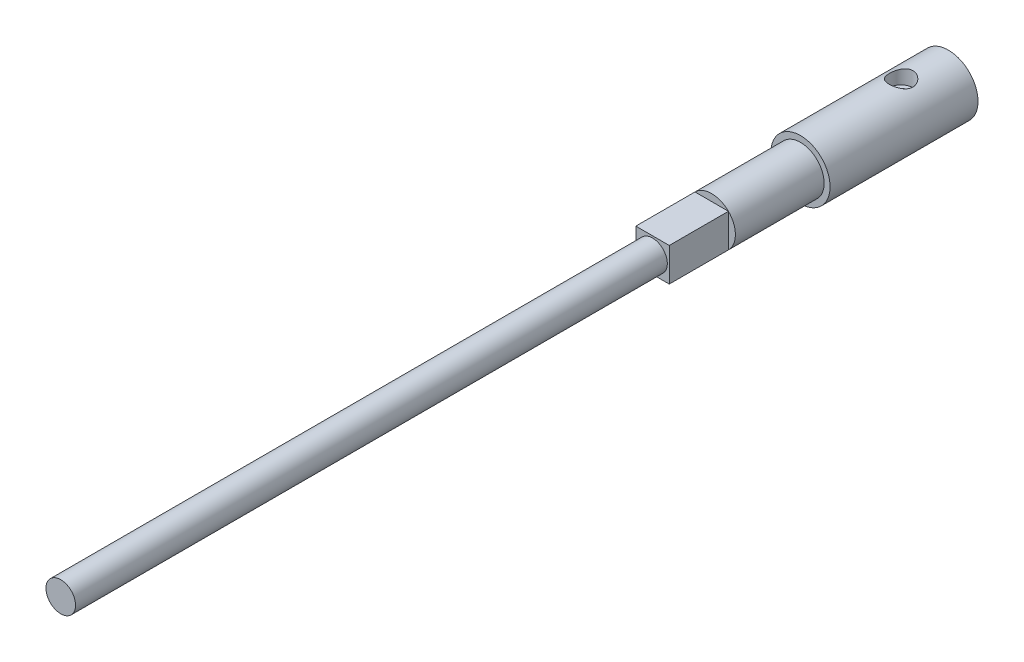
ISO-10303-21;
HEADER;
FILE_DESCRIPTION(('STEP AP214'),'2;1');
FILE_NAME('part.step','',(''),(''),'','','');
FILE_SCHEMA(('AUTOMOTIVE_DESIGN { 1 0 10303 214 1 1 1 1 }'));
ENDSEC;
DATA;
#1=APPLICATION_CONTEXT('core data for automotive mechanical design processes');
#2=APPLICATION_PROTOCOL_DEFINITION('international standard','automotive_design',2000,#1);
#3=PRODUCT_CONTEXT('',#1,'mechanical');
#4=PRODUCT('Part','Part','',(#3));
#5=PRODUCT_RELATED_PRODUCT_CATEGORY('part','',(#4));
#6=PRODUCT_DEFINITION_FORMATION('','',#4);
#7=PRODUCT_DEFINITION_CONTEXT('part definition',#1,'design');
#8=PRODUCT_DEFINITION('design','',#6,#7);
#9=PRODUCT_DEFINITION_SHAPE('','',#8);
#10=(LENGTH_UNIT() NAMED_UNIT(*) SI_UNIT(.MILLI.,.METRE.));
#11=(NAMED_UNIT(*) PLANE_ANGLE_UNIT() SI_UNIT($,.RADIAN.));
#12=(NAMED_UNIT(*) SI_UNIT($,.STERADIAN.) SOLID_ANGLE_UNIT());
#13=UNCERTAINTY_MEASURE_WITH_UNIT(LENGTH_MEASURE(1.E-05),#10,'distance_accuracy_value','');
#14=(GEOMETRIC_REPRESENTATION_CONTEXT(3) GLOBAL_UNCERTAINTY_ASSIGNED_CONTEXT((#13)) GLOBAL_UNIT_ASSIGNED_CONTEXT((#10,
#11,#12)) REPRESENTATION_CONTEXT('',''));
#15=CARTESIAN_POINT('',(0.,0.,0.));
#16=DIRECTION('',(0.,0.,1.));
#17=DIRECTION('',(1.,0.,0.));
#18=AXIS2_PLACEMENT_3D('',#15,#16,#17);
#19=CARTESIAN_POINT('',(0.,0.,27.5));
#20=DIRECTION('',(0.,0.,1.));
#21=DIRECTION('',(1.,0.,0.));
#22=AXIS2_PLACEMENT_3D('',#19,#20,#21);
#23=PLANE('',#22);
#24=DIRECTION('',(0.,1.,0.));
#25=VECTOR('',#24,1.);
#26=CARTESIAN_POINT('',(2.82842712474619,-2.82842712474619,27.5));
#27=LINE('',#26,#25);
#28=CARTESIAN_POINT('',(2.82842712474619,-2.82842712474619,27.5));
#29=VERTEX_POINT('',#28);
#30=CARTESIAN_POINT('',(2.82842712474619,2.82842712474619,27.5));
#31=VERTEX_POINT('',#30);
#32=EDGE_CURVE('E61',#29,#31,#27,.T.);
#33=ORIENTED_EDGE('',*,*,#32,.F.);
#34=CARTESIAN_POINT('',(0.,0.,27.5));
#35=DIRECTION('',(0.,0.,1.));
#36=DIRECTION('',(1.,0.,0.));
#37=AXIS2_PLACEMENT_3D('',#34,#35,#36);
#38=CIRCLE('',#37,4.);
#39=EDGE_CURVE('E233',#29,#31,#38,.T.);
#40=ORIENTED_EDGE('',*,*,#39,.T.);
#41=EDGE_LOOP('',(#33,#40));
#42=FACE_BOUND('',#41,.T.);
#43=ADVANCED_FACE('F37',(#42),#23,.T.);
#44=DIRECTION('',(1.,0.,0.));
#45=VECTOR('',#44,1.);
#46=CARTESIAN_POINT('',(-2.82842712474619,-2.82842712474619,27.5));
#47=LINE('',#46,#45);
#48=CARTESIAN_POINT('',(-2.82842712474619,-2.82842712474619,27.5));
#49=VERTEX_POINT('',#48);
#50=EDGE_CURVE('E218',#49,#29,#47,.T.);
#51=ORIENTED_EDGE('',*,*,#50,.F.);
#52=EDGE_CURVE('E414',#49,#29,#38,.T.);
#53=ORIENTED_EDGE('',*,*,#52,.T.);
#54=EDGE_LOOP('',(#51,#53));
#55=FACE_BOUND('',#54,.T.);
#56=ADVANCED_FACE('F178',(#55),#23,.T.);
#57=DIRECTION('',(0.,-1.,0.));
#58=VECTOR('',#57,1.);
#59=CARTESIAN_POINT('',(-2.82842712474619,-2.82842712474619,27.5));
#60=LINE('',#59,#58);
#61=CARTESIAN_POINT('',(-2.82842712474619,2.82842712474619,27.5));
#62=VERTEX_POINT('',#61);
#63=EDGE_CURVE('E210',#62,#49,#60,.T.);
#64=ORIENTED_EDGE('',*,*,#63,.F.);
#65=EDGE_CURVE('E213',#62,#49,#38,.T.);
#66=ORIENTED_EDGE('',*,*,#65,.T.);
#67=EDGE_LOOP('',(#64,#66));
#68=FACE_BOUND('',#67,.T.);
#69=ADVANCED_FACE('F184',(#68),#23,.T.);
#70=CARTESIAN_POINT('',(0.,0.,12.5));
#71=DIRECTION('',(0.,0.,-1.));
#72=DIRECTION('',(-1.,0.,0.));
#73=AXIS2_PLACEMENT_3D('',#70,#71,#72);
#74=CYLINDRICAL_SURFACE('',#73,5.);
#75=DIRECTION('',(0.,0.,-1.));
#76=VECTOR('',#75,1.);
#77=CARTESIAN_POINT('',(2.,-4.58257569495584,12.5));
#78=LINE('',#77,#76);
#79=CARTESIAN_POINT('',(2.,-4.58257569495584,5.));
#80=VERTEX_POINT('',#79);
#81=CARTESIAN_POINT('',(2.,-4.58257569495584,-5.));
#82=VERTEX_POINT('',#81);
#83=EDGE_CURVE('E42',#80,#82,#78,.T.);
#84=ORIENTED_EDGE('',*,*,#83,.T.);
#85=CARTESIAN_POINT('',(0.,0.,-5.));
#86=DIRECTION('',(0.,0.,-1.));
#87=DIRECTION('',(-1.,0.,0.));
#88=AXIS2_PLACEMENT_3D('',#85,#86,#87);
#89=CIRCLE('',#88,5.);
#90=CARTESIAN_POINT('',(-2.,-4.58257569495584,-5.));
#91=VERTEX_POINT('',#90);
#92=EDGE_CURVE('E245',#82,#91,#89,.T.);
#93=ORIENTED_EDGE('',*,*,#92,.T.);
#94=DIRECTION('',(0.,0.,-1.));
#95=VECTOR('',#94,1.);
#96=CARTESIAN_POINT('',(-2.,-4.58257569495584,12.5));
#97=LINE('',#96,#95);
#98=CARTESIAN_POINT('',(-2.,-4.58257569495584,5.));
#99=VERTEX_POINT('',#98);
#100=EDGE_CURVE('E110',#91,#99,#97,.F.);
#101=ORIENTED_EDGE('',*,*,#100,.T.);
#102=CARTESIAN_POINT('',(0.,0.,5.));
#103=DIRECTION('',(0.,0.,1.));
#104=DIRECTION('',(1.,0.,0.));
#105=AXIS2_PLACEMENT_3D('',#102,#103,#104);
#106=CIRCLE('',#105,5.);
#107=EDGE_CURVE('E495',#99,#80,#106,.T.);
#108=ORIENTED_EDGE('',*,*,#107,.T.);
#109=EDGE_LOOP('',(#84,#93,#101,#108));
#110=FACE_BOUND('',#109,.T.);
#111=CARTESIAN_POINT('',(0.,5.,-2.5));
#112=CARTESIAN_POINT('',(-0.107493005442891,4.99999271227085,-2.50000985182373));
#113=CARTESIAN_POINT('',(-0.215172564090673,4.99649294306932,-2.50871775208838));
#114=CARTESIAN_POINT('',(-0.427496480417896,4.98283453100641,-2.54324770352124));
#115=CARTESIAN_POINT('',(-0.532131777561248,4.97265778698877,-2.56911627908613));
#116=CARTESIAN_POINT('',(-0.734953922727403,4.94674209213118,-2.63687607805883));
#117=CARTESIAN_POINT('',(-0.833160661616958,4.93102136364072,-2.67871484621673));
#118=CARTESIAN_POINT('',(-1.02107197032837,4.89556610796078,-2.77701917332655));
#119=CARTESIAN_POINT('',(-1.11077947675099,4.87583297458057,-2.83347965491893));
#120=CARTESIAN_POINT('',(-1.28350100757039,4.83330886170419,-2.96223549856094));
#121=CARTESIAN_POINT('',(-1.36606227255021,4.8104229692919,-3.03510665624027));
#122=CARTESIAN_POINT('',(-1.51817500478472,4.76460576906194,-3.19340000347678));
#123=CARTESIAN_POINT('',(-1.58772010713353,4.74167444453792,-3.27882829721174));
#124=CARTESIAN_POINT('',(-1.71487456729288,4.69722791797136,-3.46442807024227));
#125=CARTESIAN_POINT('',(-1.77181498119547,4.67582115964951,-3.5650864860232));
#126=CARTESIAN_POINT('',(-1.86775471903715,4.63833647186793,-3.77553639842004));
#127=CARTESIAN_POINT('',(-1.90676256428583,4.62225601244176,-3.88532352784836));
#128=CARTESIAN_POINT('',(-1.96389882339587,4.59826357660818,-4.1057123335921));
#129=CARTESIAN_POINT('',(-1.98289396580565,4.59001420355605,-4.21605123557621));
#130=CARTESIAN_POINT('',(-2.00217296164003,4.58164004049144,-4.43863499830727));
#131=CARTESIAN_POINT('',(-2.00246601631322,4.58151125522768,-4.55087889462501));
#132=CARTESIAN_POINT('',(-1.98498936750454,4.58910500279994,-4.76575667145804));
#133=CARTESIAN_POINT('',(-1.96847531430514,4.5962817503845,-4.86851571440903));
#134=CARTESIAN_POINT('',(-1.91994688029782,4.61676187607836,-5.06965955600671));
#135=CARTESIAN_POINT('',(-1.88792979480463,4.63006632321673,-5.16804358811031));
#136=CARTESIAN_POINT('',(-1.80869473255107,4.6615948508853,-5.36001783619604));
#137=CARTESIAN_POINT('',(-1.76117986231532,4.67991379280788,-5.45346923905469));
#138=CARTESIAN_POINT('',(-1.65250646073221,4.7193811638989,-5.63141581636156));
#139=CARTESIAN_POINT('',(-1.59134280510084,4.74053065456848,-5.71590760940281));
#140=CARTESIAN_POINT('',(-1.45155059945443,4.78526736742271,-5.880409728802));
#141=CARTESIAN_POINT('',(-1.37193746297063,4.80891664976152,-5.95956872944602));
#142=CARTESIAN_POINT('',(-1.20031442743019,4.85459824958282,-6.10368447800204));
#143=CARTESIAN_POINT('',(-1.10830206533443,4.87663024445325,-6.16863839741029));
#144=CARTESIAN_POINT('',(-0.912077652605843,4.91714681264548,-6.28361744741583));
#145=CARTESIAN_POINT('',(-0.807660491346478,4.93555270095415,-6.33332228119705));
#146=CARTESIAN_POINT('',(-0.591023765482882,4.96614828328759,-6.41416786107806));
#147=CARTESIAN_POINT('',(-0.478808196849674,4.97834113462382,-6.44531803755741));
#148=CARTESIAN_POINT('',(-0.25689588760782,4.99456139506911,-6.4864482954197));
#149=CARTESIAN_POINT('',(-0.147443293985534,4.99902945833514,-6.49757245425356));
#150=CARTESIAN_POINT('',(0.0718453098078175,5.00068478510631,-6.50171310052861));
#151=CARTESIAN_POINT('',(0.181681213223924,4.99787393582291,-6.49473428154751));
#152=CARTESIAN_POINT('',(0.393432739121988,4.98557567063753,-6.46370824744801));
#153=CARTESIAN_POINT('',(0.495482491775474,4.97639391345523,-6.44044201964902));
#154=CARTESIAN_POINT('',(0.69413542806078,4.952594414055,-6.37856429169019));
#155=CARTESIAN_POINT('',(0.790737910224845,4.9379759735653,-6.33995082033132));
#156=CARTESIAN_POINT('',(0.979078785816702,4.90416594770812,-6.24721506032005));
#157=CARTESIAN_POINT('',(1.07057802275541,4.88484815979804,-6.19265452795685));
#158=CARTESIAN_POINT('',(1.24344359124656,4.84373364745525,-6.07005967609436));
#159=CARTESIAN_POINT('',(1.32480584076113,4.8219359311027,-6.00201995707739));
#160=CARTESIAN_POINT('',(1.48072304302882,4.77645117638112,-5.84912998705037));
#161=CARTESIAN_POINT('',(1.55447393380607,4.75273441425052,-5.76346645849379));
#162=CARTESIAN_POINT('',(1.68675119741371,4.70741672917132,-5.58055991699063));
#163=CARTESIAN_POINT('',(1.74527506133751,4.68581615526511,-5.48331499966005));
#164=CARTESIAN_POINT('',(1.84580750193163,4.64714299907709,-5.2785383054059));
#165=CARTESIAN_POINT('',(1.88765059453445,4.63011630884788,-5.17091600078769));
#166=CARTESIAN_POINT('',(1.9522962197053,4.60323673477932,-4.94926634828485));
#167=CARTESIAN_POINT('',(1.97511280526932,4.59337855695998,-4.83524379418757));
#168=CARTESIAN_POINT('',(1.9997156172784,4.58271759299926,-4.61287209822546));
#169=CARTESIAN_POINT('',(2.00289708230287,4.58131421008171,-4.50470516040665));
#170=CARTESIAN_POINT('',(1.99180315927752,4.58614836033098,-4.28945514228671));
#171=CARTESIAN_POINT('',(1.97752998791378,4.59238492324793,-4.18237192609742));
#172=CARTESIAN_POINT('',(1.93307136615365,4.61126649079021,-3.97666781014496));
#173=CARTESIAN_POINT('',(1.90353749357098,4.62364831827449,-3.877879725567));
#174=CARTESIAN_POINT('',(1.83000544849101,4.65324001232697,-3.68662137038652));
#175=CARTESIAN_POINT('',(1.78600328139381,4.67045121206007,-3.59415285310017));
#176=CARTESIAN_POINT('',(1.68187276275973,4.70898609604491,-3.41239038072922));
#177=CARTESIAN_POINT('',(1.62096533515949,4.73048882313242,-3.32358132986952));
#178=CARTESIAN_POINT('',(1.4858921192715,4.77463804372237,-3.15700668279624));
#179=CARTESIAN_POINT('',(1.41172233481812,4.79728488048406,-3.07924442787169));
#180=CARTESIAN_POINT('',(1.24650550627246,4.84293567087394,-2.93179714673639));
#181=CARTESIAN_POINT('',(1.15467600114614,4.86586757962185,-2.86296269310193));
#182=CARTESIAN_POINT('',(0.959900320285779,4.90800406713717,-2.74166295737837));
#183=CARTESIAN_POINT('',(0.856949004547237,4.92720691092906,-2.68920528784747));
#184=CARTESIAN_POINT('',(0.644738062495202,4.95939714815861,-2.60337778480971));
#185=CARTESIAN_POINT('',(0.535631618219695,4.97249363055028,-2.56967067643966));
#186=CARTESIAN_POINT('',(0.312876546281219,4.99144306209366,-2.52136087904573));
#187=CARTESIAN_POINT('',(0.199243525858912,4.99731899495638,-2.5066975632561));
#188=CARTESIAN_POINT('',(0.0569122978909293,4.99975899504136,-2.50060461902173));
#189=CARTESIAN_POINT('',(0.0284626887407582,5.00000192969176,-2.49999739137081));
#190=CARTESIAN_POINT('',(0.,5.,-2.5));
#191=B_SPLINE_CURVE_WITH_KNOTS('',3,(#111,#112,#113,#114,#115,#116,#117,#118,#119,#120,#121,
#122,#123,#124,#125,#126,#127,#128,#129,#130,#131,#132,#133,#134,#135,#136,#137,#138,#139,#140,
#141,#142,#143,#144,#145,#146,#147,#148,#149,#150,#151,#152,#153,#154,#155,#156,#157,#158,#159,
#160,#161,#162,#163,#164,#165,#166,#167,#168,#169,#170,#171,#172,#173,#174,#175,#176,#177,#178,
#179,#180,#181,#182,#183,#184,#185,#186,#187,#188,#189,#190),.UNSPECIFIED.,.T.,.F.,(4,2,2,2,2,2,
2,2,2,2,2,2,2,2,2,2,2,2,2,2,2,2,2,2,2,2,2,2,2,2,2,2,2,2,2,2,2,2,2,4),(0.,0.322402987893071,
0.645683636007934,0.96791145747158,1.29002753567984,1.62597381700397,1.96208394934411,
2.31315258819217,2.66405423118268,2.99904105308828,3.33386306340488,3.64538328401372,
3.95695787256047,4.27489126298816,4.59294421938183,4.93558349186557,5.27829092839733,
5.62776913162806,5.9770695611379,6.30569184528007,6.63422893570082,6.94800455564365,
7.26182048993796,7.58523513398263,7.90877959498969,8.25368474624414,8.59864669043748,
8.94695045140827,9.29499672645934,9.61799673392748,9.94095572563045,10.2511431854877,
10.5614163580516,10.8894546805669,11.2175920134839,11.5670042353384,11.9165786364053,
12.2596430101332,12.6016125240434,12.686980458968),.UNSPECIFIED.);
#192=CARTESIAN_POINT('',(0.,5.,-2.5));
#193=VERTEX_POINT('',#192);
#194=EDGE_CURVE('E246',#193,#193,#191,.T.);
#195=ORIENTED_EDGE('',*,*,#194,.T.);
#196=EDGE_LOOP('',(#195));
#197=FACE_BOUND('',#196,.T.);
#198=CARTESIAN_POINT('',(0.,0.,12.5));
#199=DIRECTION('',(0.,0.,1.));
#200=DIRECTION('',(1.,0.,0.));
#201=AXIS2_PLACEMENT_3D('',#198,#199,#200);
#202=CIRCLE('',#201,5.);
#203=CARTESIAN_POINT('',(5.,0.,12.5));
#204=VERTEX_POINT('',#203);
#205=EDGE_CURVE('E256',#204,#204,#202,.T.);
#206=ORIENTED_EDGE('',*,*,#205,.F.);
#207=EDGE_LOOP('',(#206));
#208=FACE_BOUND('',#207,.T.);
#209=CARTESIAN_POINT('',(0.,0.,-12.5));
#210=DIRECTION('',(0.,0.,1.));
#211=DIRECTION('',(1.,0.,0.));
#212=AXIS2_PLACEMENT_3D('',#209,#210,#211);
#213=CIRCLE('',#212,5.);
#214=CARTESIAN_POINT('',(5.,0.,-12.5));
#215=VERTEX_POINT('',#214);
#216=EDGE_CURVE('E253',#215,#215,#213,.T.);
#217=ORIENTED_EDGE('',*,*,#216,.T.);
#218=EDGE_LOOP('',(#217));
#219=FACE_BOUND('',#218,.T.);
#220=ADVANCED_FACE('F39',(#110,#197,#208,#219),#74,.T.);
#221=CARTESIAN_POINT('',(0.,0.,12.5));
#222=DIRECTION('',(0.,0.,1.));
#223=DIRECTION('',(1.,0.,0.));
#224=AXIS2_PLACEMENT_3D('',#221,#222,#223);
#225=PLANE('',#224);
#226=CARTESIAN_POINT('',(0.,0.,12.5));
#227=DIRECTION('',(0.,0.,1.));
#228=DIRECTION('',(1.,0.,0.));
#229=AXIS2_PLACEMENT_3D('',#226,#227,#228);
#230=CIRCLE('',#229,4.);
#231=CARTESIAN_POINT('',(4.,0.,12.5));
#232=VERTEX_POINT('',#231);
#233=EDGE_CURVE('E242',#232,#232,#230,.T.);
#234=ORIENTED_EDGE('',*,*,#233,.F.);
#235=EDGE_LOOP('',(#234));
#236=FACE_BOUND('',#235,.T.);
#237=ORIENTED_EDGE('',*,*,#205,.T.);
#238=EDGE_LOOP('',(#237));
#239=FACE_BOUND('',#238,.T.);
#240=ADVANCED_FACE('F205',(#236,#239),#225,.T.);
#241=CARTESIAN_POINT('',(0.,0.,-12.5));
#242=DIRECTION('',(0.,0.,1.));
#243=DIRECTION('',(1.,0.,0.));
#244=AXIS2_PLACEMENT_3D('',#241,#242,#243);
#245=PLANE('',#244);
#246=CARTESIAN_POINT('',(0.,0.,-12.5));
#247=DIRECTION('',(0.,0.,-1.));
#248=DIRECTION('',(-1.,0.,0.));
#249=AXIS2_PLACEMENT_3D('',#246,#247,#248);
#250=CIRCLE('',#249,2.);
#251=CARTESIAN_POINT('',(-2.,0.,-12.5));
#252=VERTEX_POINT('',#251);
#253=EDGE_CURVE('E249',#252,#252,#250,.T.);
#254=ORIENTED_EDGE('',*,*,#253,.F.);
#255=EDGE_LOOP('',(#254));
#256=FACE_BOUND('',#255,.T.);
#257=ORIENTED_EDGE('',*,*,#216,.F.);
#258=EDGE_LOOP('',(#257));
#259=FACE_BOUND('',#258,.T.);
#260=ADVANCED_FACE('F281',(#256,#259),#245,.F.);
#261=CARTESIAN_POINT('',(0.,0.,3.));
#262=DIRECTION('',(0.,0.,-1.));
#263=DIRECTION('',(-1.,0.,0.));
#264=AXIS2_PLACEMENT_3D('',#261,#262,#263);
#265=CYLINDRICAL_SURFACE('',#264,2.);
#266=CARTESIAN_POINT('',(0.,2.,-3.235));
#267=CARTESIAN_POINT('',(-0.0641398971896876,1.99999583451551,-3.23500445752303));
#268=CARTESIAN_POINT('',(-0.128347981231434,1.99688283154695,-3.23991072111328));
#269=CARTESIAN_POINT('',(-0.254783299840627,1.9847261998257,-3.25926732022796));
#270=CARTESIAN_POINT('',(-0.317006907688615,1.975672299768,-3.2737341855287));
#271=CARTESIAN_POINT('',(-0.437402357164334,1.95254189197848,-3.31136069275631));
#272=CARTESIAN_POINT('',(-0.4955925614655,1.93849021687504,-3.33447738500805));
#273=CARTESIAN_POINT('',(-0.607060253985866,1.90652691806298,-3.38845064250181));
#274=CARTESIAN_POINT('',(-0.660338097269636,1.88861557364334,-3.41930664774696));
#275=CARTESIAN_POINT('',(-0.76533760648393,1.8486919727573,-3.4906279593132));
#276=CARTESIAN_POINT('',(-0.816585458204851,1.82646527046671,-3.53166835998512));
#277=CARTESIAN_POINT('',(-0.911928941984572,1.78078270926189,-3.62086364731089));
#278=CARTESIAN_POINT('',(-0.956014661242751,1.7573252052254,-3.66902822113366));
#279=CARTESIAN_POINT('',(-1.04204162442653,1.70790370131302,-3.77895538261462));
#280=CARTESIAN_POINT('',(-1.08282756223249,1.68204604024975,-3.84167757823787));
#281=CARTESIAN_POINT('',(-1.15317017077356,1.63462610458897,-3.97459347983791));
#282=CARTESIAN_POINT('',(-1.18274596413177,1.6130565453782,-4.04477419851384));
#283=CARTESIAN_POINT('',(-1.22297925468817,1.58265035995747,-4.17177250305462));
#284=CARTESIAN_POINT('',(-1.2365719056413,1.57195472550304,-4.227211909711));
#285=CARTESIAN_POINT('',(-1.25616743131337,1.55634362702246,-4.34017899853523));
#286=CARTESIAN_POINT('',(-1.26218143300662,1.55141968973342,-4.39770349132526));
#287=CARTESIAN_POINT('',(-1.26625612358782,1.54809697147055,-4.51339462503927));
#288=CARTESIAN_POINT('',(-1.26429414738918,1.54971678558836,-4.57156262684556));
#289=CARTESIAN_POINT('',(-1.25250149463257,1.55926048826078,-4.68658404545839));
#290=CARTESIAN_POINT('',(-1.24266441320798,1.56718950809551,-4.7434363534637));
#291=CARTESIAN_POINT('',(-1.21605607650377,1.58791652147207,-4.8528819456915));
#292=CARTESIAN_POINT('',(-1.1994734180609,1.60058138528441,-4.90554781963099));
#293=CARTESIAN_POINT('',(-1.16004729158687,1.62938177656198,-5.0074483597796));
#294=CARTESIAN_POINT('',(-1.13720162712076,1.6455185211871,-5.05668181462808));
#295=CARTESIAN_POINT('',(-1.08090868859321,1.68314789002275,-5.16027822184603));
#296=CARTESIAN_POINT('',(-1.0462715053514,1.70507545999583,-5.21383609804483));
#297=CARTESIAN_POINT('',(-0.969575801035025,1.74982825083907,-5.31497378139));
#298=CARTESIAN_POINT('',(-0.927509529110708,1.77265438967727,-5.36254725530727));
#299=CARTESIAN_POINT('',(-0.828555490689367,1.82127265144635,-5.4587862922658));
#300=CARTESIAN_POINT('',(-0.770362526836884,1.84689316097806,-5.50621208541179));
#301=CARTESIAN_POINT('',(-0.64536720245965,1.89419081874508,-5.59059723824559));
#302=CARTESIAN_POINT('',(-0.578567765552464,1.91586930008403,-5.62756013860687));
#303=CARTESIAN_POINT('',(-0.441417909203294,1.95190049859582,-5.68772491054922));
#304=CARTESIAN_POINT('',(-0.371418018227986,1.96656830419091,-5.71152827509453));
#305=CARTESIAN_POINT('',(-0.227256022950436,1.98837663484214,-5.74661929025075));
#306=CARTESIAN_POINT('',(-0.153100276928693,1.99552834499559,-5.75792553977758));
#307=CARTESIAN_POINT('',(-0.0150443947392962,2.00095154384728,-5.76650576771821));
#308=CARTESIAN_POINT('',(0.0487000786151712,2.00040825907771,-5.76565248395763));
#309=CARTESIAN_POINT('',(0.175002096638428,1.99333150932072,-5.75443825596075));
#310=CARTESIAN_POINT('',(0.237559743161146,1.98679856076382,-5.74407813140694));
#311=CARTESIAN_POINT('',(0.356958746338143,1.96877402032659,-5.71507922040856));
#312=CARTESIAN_POINT('',(0.413930517356735,1.95751350114147,-5.69682515853084));
#313=CARTESIAN_POINT('',(0.523929395927478,1.9309847673716,-5.65292350547555));
#314=CARTESIAN_POINT('',(0.576955869561567,1.91571591051677,-5.6272747293521));
#315=CARTESIAN_POINT('',(0.683300017560304,1.88056955609533,-5.56650948446215));
#316=CARTESIAN_POINT('',(0.73612084546805,1.86038453504622,-5.53070455031039));
#317=CARTESIAN_POINT('',(0.835363028185637,1.81798989498065,-5.45205575978611));
#318=CARTESIAN_POINT('',(0.881777351052547,1.79577809503112,-5.40920428019484));
#319=CARTESIAN_POINT('',(0.97408420952832,1.74764241464614,-5.31032091232285));
#320=CARTESIAN_POINT('',(1.01886582463772,1.72165911173498,-5.25327641233783));
#321=CARTESIAN_POINT('',(1.0984124911153,1.67203099387941,-5.13165410614749));
#322=CARTESIAN_POINT('',(1.1331832146346,1.64838485970762,-5.06708059512203));
#323=CARTESIAN_POINT('',(1.18548206257003,1.61103888859156,-4.94530460650041));
#324=CARTESIAN_POINT('',(1.20508593578185,1.59629361167847,-4.88931936389625));
#325=CARTESIAN_POINT('',(1.23638379319438,1.57218008203059,-4.77410025816086));
#326=CARTESIAN_POINT('',(1.24809043404831,1.56280322915418,-4.71487175843241));
#327=CARTESIAN_POINT('',(1.26295376509362,1.55082120562967,-4.59425137160863));
#328=CARTESIAN_POINT('',(1.26605576505983,1.54825935463943,-4.53284814725463));
#329=CARTESIAN_POINT('',(1.26330692823587,1.55050239245532,-4.41036835133424));
#330=CARTESIAN_POINT('',(1.25745399902132,1.55530900298953,-4.34929185945927));
#331=CARTESIAN_POINT('',(1.23816295067698,1.57069470299806,-4.23498593621245));
#332=CARTESIAN_POINT('',(1.22546458092782,1.58070790263023,-4.18154858643679));
#333=CARTESIAN_POINT('',(1.19364136951954,1.60487311274546,-4.07762322613425));
#334=CARTESIAN_POINT('',(1.17451368655124,1.61902695274433,-4.02713653119157));
#335=CARTESIAN_POINT('',(1.12732537222111,1.65229547674795,-3.92286639224386));
#336=CARTESIAN_POINT('',(1.09838737426739,1.67182772376109,-3.86961598514621));
#337=CARTESIAN_POINT('',(1.03360807311774,1.71263610624799,-3.76821830562785));
#338=CARTESIAN_POINT('',(0.997761340339609,1.73391360571256,-3.72007509340224));
#339=CARTESIAN_POINT('',(0.911498797078055,1.78102742292201,-3.6198703856344));
#340=CARTESIAN_POINT('',(0.859603629731192,1.80688975977774,-3.56908300006283));
#341=CARTESIAN_POINT('',(0.747146521846098,1.85621738441925,-3.47662583786158));
#342=CARTESIAN_POINT('',(0.686578483791245,1.87968096568333,-3.43496252854108));
#343=CARTESIAN_POINT('',(0.556982882027526,1.9221022816613,-3.36175446916782));
#344=CARTESIAN_POINT('',(0.48785625570613,1.94099797610923,-3.33034720421405));
#345=CARTESIAN_POINT('',(0.343770721989152,1.97159667067497,-3.28023930357989));
#346=CARTESIAN_POINT('',(0.268832902256277,1.98332442127521,-3.26149491983881));
#347=CARTESIAN_POINT('',(0.160767129550048,1.99378651557286,-3.24484270167468));
#348=CARTESIAN_POINT('',(0.128776914269651,1.99610923989277,-3.24115913094843));
#349=CARTESIAN_POINT('',(0.0645302305515636,1.9992170731484,-3.23623659019986));
#350=CARTESIAN_POINT('',(0.0322737473052654,2.00000209597769,-3.23499775707511));
#351=CARTESIAN_POINT('',(0.,2.,-3.235));
#352=B_SPLINE_CURVE_WITH_KNOTS('',3,(#266,#267,#268,#269,#270,#271,#272,#273,#274,#275,#276,
#277,#278,#279,#280,#281,#282,#283,#284,#285,#286,#287,#288,#289,#290,#291,#292,#293,#294,#295,
#296,#297,#298,#299,#300,#301,#302,#303,#304,#305,#306,#307,#308,#309,#310,#311,#312,#313,#314,
#315,#316,#317,#318,#319,#320,#321,#322,#323,#324,#325,#326,#327,#328,#329,#330,#331,#332,#333,
#334,#335,#336,#337,#338,#339,#340,#341,#342,#343,#344,#345,#346,#347,#348,#349,#350,#351),
.UNSPECIFIED.,.T.,.F.,(4,2,2,2,2,2,2,2,2,2,2,2,2,2,2,2,2,2,2,2,2,2,2,2,2,2,2,2,2,2,2,2,2,2,2,2,
2,2,2,2,2,2,4),(0.,0.192284887373756,0.384903097997015,0.576577311065574,0.768237659078059,
0.975388748148183,1.18282414756246,1.41917139546885,1.65511364052336,1.8286207027707,
2.00187272398616,2.17561741368794,2.34950355464012,2.51882993606438,2.68821577635025,
2.88981425871805,3.0916243271106,3.32841148846338,3.56511842429264,3.78985216442906,
4.0142509908327,4.20451890823339,4.39477042222173,4.57664246029769,4.7585436581777,
4.95855900880429,5.1587921846033,5.38889816213887,5.61887350434901,5.80152865754721,
5.98389037498497,6.16740853788894,6.35096958851647,6.51780475020444,6.68471373857842,
6.87506746399463,7.06557140317343,7.29577392754907,7.52613909923493,7.75947644454734,
7.99200346973747,8.08875146379936,8.18550487528939),.UNSPECIFIED.);
#353=CARTESIAN_POINT('',(0.,2.,-3.235));
#354=VERTEX_POINT('',#353);
#355=EDGE_CURVE('E135',#354,#354,#352,.T.);
#356=ORIENTED_EDGE('',*,*,#355,.F.);
#357=EDGE_LOOP('',(#356));
#358=FACE_BOUND('',#357,.T.);
#359=CARTESIAN_POINT('',(0.,0.,3.));
#360=DIRECTION('',(0.,0.,-1.));
#361=DIRECTION('',(-1.,0.,0.));
#362=AXIS2_PLACEMENT_3D('',#359,#360,#361);
#363=CIRCLE('',#362,2.);
#364=CARTESIAN_POINT('',(-2.,0.,3.));
#365=VERTEX_POINT('',#364);
#366=EDGE_CURVE('E250',#365,#365,#363,.T.);
#367=ORIENTED_EDGE('',*,*,#366,.F.);
#368=EDGE_LOOP('',(#367));
#369=FACE_BOUND('',#368,.T.);
#370=ORIENTED_EDGE('',*,*,#253,.T.);
#371=EDGE_LOOP('',(#370));
#372=FACE_BOUND('',#371,.T.);
#373=ADVANCED_FACE('F277',(#358,#369,#372),#265,.F.);
#374=CARTESIAN_POINT('',(0.,0.,3.));
#375=DIRECTION('',(0.,0.,-1.));
#376=DIRECTION('',(-1.,0.,0.));
#377=AXIS2_PLACEMENT_3D('',#374,#375,#376);
#378=PLANE('',#377);
#379=ORIENTED_EDGE('',*,*,#366,.T.);
#380=EDGE_LOOP('',(#379));
#381=FACE_BOUND('',#380,.T.);
#382=ADVANCED_FACE('F273',(#381),#378,.T.);
#383=CARTESIAN_POINT('',(0.,2.5,-4.5));
#384=DIRECTION('',(0.,1.,0.));
#385=DIRECTION('',(0.,0.,1.));
#386=AXIS2_PLACEMENT_3D('',#383,#384,#385);
#387=CYLINDRICAL_SURFACE('',#386,2.);
#388=CARTESIAN_POINT('',(0.,2.5,-4.5));
#389=DIRECTION('',(0.,1.,0.));
#390=DIRECTION('',(0.,0.,1.));
#391=AXIS2_PLACEMENT_3D('',#388,#389,#390);
#392=CIRCLE('',#391,2.);
#393=CARTESIAN_POINT('',(0.,2.5,-2.5));
#394=VERTEX_POINT('',#393);
#395=EDGE_CURVE('E241',#394,#394,#392,.T.);
#396=ORIENTED_EDGE('',*,*,#395,.F.);
#397=EDGE_LOOP('',(#396));
#398=FACE_BOUND('',#397,.T.);
#399=ORIENTED_EDGE('',*,*,#194,.F.);
#400=EDGE_LOOP('',(#399));
#401=FACE_BOUND('',#400,.T.);
#402=ADVANCED_FACE('F268',(#398,#401),#387,.F.);
#403=CARTESIAN_POINT('',(0.,2.5,-4.5));
#404=DIRECTION('',(0.,1.,0.));
#405=DIRECTION('',(0.,0.,1.));
#406=AXIS2_PLACEMENT_3D('',#403,#404,#405);
#407=PLANE('',#406);
#408=CARTESIAN_POINT('',(0.,2.5,-4.5));
#409=DIRECTION('',(0.,1.,0.));
#410=DIRECTION('',(0.,0.,1.));
#411=AXIS2_PLACEMENT_3D('',#408,#409,#410);
#412=CIRCLE('',#411,1.265);
#413=CARTESIAN_POINT('',(0.,2.5,-3.235));
#414=VERTEX_POINT('',#413);
#415=EDGE_CURVE('E147',#414,#414,#412,.T.);
#416=ORIENTED_EDGE('',*,*,#415,.F.);
#417=EDGE_LOOP('',(#416));
#418=FACE_BOUND('',#417,.T.);
#419=ORIENTED_EDGE('',*,*,#395,.T.);
#420=EDGE_LOOP('',(#419));
#421=FACE_BOUND('',#420,.T.);
#422=ADVANCED_FACE('F198',(#418,#421),#407,.T.);
#423=CARTESIAN_POINT('',(0.,0.,27.5));
#424=DIRECTION('',(0.,0.,-1.));
#425=DIRECTION('',(-1.,0.,0.));
#426=AXIS2_PLACEMENT_3D('',#423,#424,#425);
#427=CYLINDRICAL_SURFACE('',#426,4.);
#428=EDGE_CURVE('E239',#31,#62,#38,.T.);
#429=ORIENTED_EDGE('',*,*,#428,.F.);
#430=ORIENTED_EDGE('',*,*,#39,.F.);
#431=ORIENTED_EDGE('',*,*,#52,.F.);
#432=ORIENTED_EDGE('',*,*,#65,.F.);
#433=EDGE_LOOP('',(#429,#430,#431,#432));
#434=FACE_BOUND('',#433,.T.);
#435=ORIENTED_EDGE('',*,*,#233,.T.);
#436=EDGE_LOOP('',(#435));
#437=FACE_BOUND('',#436,.T.);
#438=ADVANCED_FACE('F190',(#434,#437),#427,.T.);
#439=DIRECTION('',(-1.,0.,0.));
#440=VECTOR('',#439,1.);
#441=CARTESIAN_POINT('',(-2.82842712474619,2.82842712474619,27.5));
#442=LINE('',#441,#440);
#443=EDGE_CURVE('E219',#31,#62,#442,.T.);
#444=ORIENTED_EDGE('',*,*,#443,.F.);
#445=ORIENTED_EDGE('',*,*,#428,.T.);
#446=EDGE_LOOP('',(#444,#445));
#447=FACE_BOUND('',#446,.T.);
#448=ADVANCED_FACE('F180',(#447),#23,.T.);
#449=CARTESIAN_POINT('',(2.82842712474619,-2.82842712474619,37.5));
#450=DIRECTION('',(-1.,0.,0.));
#451=DIRECTION('',(0.,0.,1.));
#452=AXIS2_PLACEMENT_3D('',#449,#450,#451);
#453=PLANE('',#452);
#454=ORIENTED_EDGE('',*,*,#32,.T.);
#455=DIRECTION('',(0.,0.,-1.));
#456=VECTOR('',#455,1.);
#457=CARTESIAN_POINT('',(2.82842712474619,2.82842712474619,37.5));
#458=LINE('',#457,#456);
#459=CARTESIAN_POINT('',(2.82842712474619,2.82842712474619,37.5));
#460=VERTEX_POINT('',#459);
#461=EDGE_CURVE('E227',#460,#31,#458,.T.);
#462=ORIENTED_EDGE('',*,*,#461,.F.);
#463=DIRECTION('',(0.,1.,0.));
#464=VECTOR('',#463,1.);
#465=CARTESIAN_POINT('',(2.82842712474619,-2.82842712474619,37.5));
#466=LINE('',#465,#464);
#467=CARTESIAN_POINT('',(2.82842712474619,-2.82842712474619,37.5));
#468=VERTEX_POINT('',#467);
#469=EDGE_CURVE('E403',#468,#460,#466,.T.);
#470=ORIENTED_EDGE('',*,*,#469,.F.);
#471=DIRECTION('',(0.,0.,-1.));
#472=VECTOR('',#471,1.);
#473=CARTESIAN_POINT('',(2.82842712474619,-2.82842712474619,37.5));
#474=LINE('',#473,#472);
#475=EDGE_CURVE('E235',#468,#29,#474,.T.);
#476=ORIENTED_EDGE('',*,*,#475,.T.);
#477=EDGE_LOOP('',(#454,#462,#470,#476));
#478=FACE_BOUND('',#477,.T.);
#479=ADVANCED_FACE('F189',(#478),#453,.F.);
#480=CARTESIAN_POINT('',(-2.82842712474619,2.82842712474619,37.5));
#481=DIRECTION('',(0.,-1.,0.));
#482=DIRECTION('',(0.,0.,-1.));
#483=AXIS2_PLACEMENT_3D('',#480,#481,#482);
#484=PLANE('',#483);
#485=ORIENTED_EDGE('',*,*,#443,.T.);
#486=DIRECTION('',(0.,0.,-1.));
#487=VECTOR('',#486,1.);
#488=CARTESIAN_POINT('',(-2.82842712474619,2.82842712474619,37.5));
#489=LINE('',#488,#487);
#490=CARTESIAN_POINT('',(-2.82842712474619,2.82842712474619,37.5));
#491=VERTEX_POINT('',#490);
#492=EDGE_CURVE('E224',#491,#62,#489,.T.);
#493=ORIENTED_EDGE('',*,*,#492,.F.);
#494=DIRECTION('',(-1.,0.,0.));
#495=VECTOR('',#494,1.);
#496=CARTESIAN_POINT('',(-2.82842712474619,2.82842712474619,37.5));
#497=LINE('',#496,#495);
#498=EDGE_CURVE('E409',#460,#491,#497,.T.);
#499=ORIENTED_EDGE('',*,*,#498,.F.);
#500=ORIENTED_EDGE('',*,*,#461,.T.);
#501=EDGE_LOOP('',(#485,#493,#499,#500));
#502=FACE_BOUND('',#501,.T.);
#503=ADVANCED_FACE('F196',(#502),#484,.F.);
#504=CARTESIAN_POINT('',(-2.82842712474619,-2.82842712474619,37.5));
#505=DIRECTION('',(1.,0.,0.));
#506=DIRECTION('',(0.,0.,-1.));
#507=AXIS2_PLACEMENT_3D('',#504,#505,#506);
#508=PLANE('',#507);
#509=ORIENTED_EDGE('',*,*,#63,.T.);
#510=DIRECTION('',(0.,0.,-1.));
#511=VECTOR('',#510,1.);
#512=CARTESIAN_POINT('',(-2.82842712474619,-2.82842712474619,37.5));
#513=LINE('',#512,#511);
#514=CARTESIAN_POINT('',(-2.82842712474619,-2.82842712474619,37.5));
#515=VERTEX_POINT('',#514);
#516=EDGE_CURVE('E231',#515,#49,#513,.T.);
#517=ORIENTED_EDGE('',*,*,#516,.F.);
#518=DIRECTION('',(0.,-1.,0.));
#519=VECTOR('',#518,1.);
#520=CARTESIAN_POINT('',(-2.82842712474619,-2.82842712474619,37.5));
#521=LINE('',#520,#519);
#522=EDGE_CURVE('E230',#491,#515,#521,.T.);
#523=ORIENTED_EDGE('',*,*,#522,.F.);
#524=ORIENTED_EDGE('',*,*,#492,.T.);
#525=EDGE_LOOP('',(#509,#517,#523,#524));
#526=FACE_BOUND('',#525,.T.);
#527=ADVANCED_FACE('F229',(#526),#508,.F.);
#528=CARTESIAN_POINT('',(-2.82842712474619,-2.82842712474619,37.5));
#529=DIRECTION('',(0.,1.,0.));
#530=DIRECTION('',(0.,0.,1.));
#531=AXIS2_PLACEMENT_3D('',#528,#529,#530);
#532=PLANE('',#531);
#533=ORIENTED_EDGE('',*,*,#50,.T.);
#534=ORIENTED_EDGE('',*,*,#475,.F.);
#535=DIRECTION('',(1.,0.,0.));
#536=VECTOR('',#535,1.);
#537=CARTESIAN_POINT('',(-2.82842712474619,-2.82842712474619,37.5));
#538=LINE('',#537,#536);
#539=EDGE_CURVE('E399',#515,#468,#538,.T.);
#540=ORIENTED_EDGE('',*,*,#539,.F.);
#541=ORIENTED_EDGE('',*,*,#516,.T.);
#542=EDGE_LOOP('',(#533,#534,#540,#541));
#543=FACE_BOUND('',#542,.T.);
#544=ADVANCED_FACE('F370',(#543),#532,.F.);
#545=CARTESIAN_POINT('',(0.,0.,37.5));
#546=DIRECTION('',(0.,0.,-1.));
#547=DIRECTION('',(-1.,0.,0.));
#548=AXIS2_PLACEMENT_3D('',#545,#546,#547);
#549=PLANE('',#548);
#550=CARTESIAN_POINT('',(0.,0.,37.5));
#551=DIRECTION('',(0.,0.,1.));
#552=DIRECTION('',(1.,0.,0.));
#553=AXIS2_PLACEMENT_3D('',#550,#551,#552);
#554=CIRCLE('',#553,2.5);
#555=CARTESIAN_POINT('',(2.5,0.,37.5));
#556=VERTEX_POINT('',#555);
#557=EDGE_CURVE('E11',#556,#556,#554,.T.);
#558=ORIENTED_EDGE('',*,*,#557,.F.);
#559=EDGE_LOOP('',(#558));
#560=FACE_BOUND('',#559,.T.);
#561=ORIENTED_EDGE('',*,*,#469,.T.);
#562=ORIENTED_EDGE('',*,*,#498,.T.);
#563=ORIENTED_EDGE('',*,*,#522,.T.);
#564=ORIENTED_EDGE('',*,*,#539,.T.);
#565=EDGE_LOOP('',(#561,#562,#563,#564));
#566=FACE_BOUND('',#565,.T.);
#567=ADVANCED_FACE('F365',(#560,#566),#549,.F.);
#568=CARTESIAN_POINT('',(0.,-5.001,-4.5));
#569=DIRECTION('',(0.,1.,0.));
#570=DIRECTION('',(0.,0.,1.));
#571=AXIS2_PLACEMENT_3D('',#568,#569,#570);
#572=CYLINDRICAL_SURFACE('',#571,1.265);
#573=ORIENTED_EDGE('',*,*,#415,.T.);
#574=EDGE_LOOP('',(#573));
#575=FACE_BOUND('',#574,.T.);
#576=ORIENTED_EDGE('',*,*,#355,.T.);
#577=EDGE_LOOP('',(#576));
#578=FACE_BOUND('',#577,.T.);
#579=ADVANCED_FACE('F149',(#575,#578),#572,.F.);
#580=CARTESIAN_POINT('',(-2.,-3.,5.));
#581=DIRECTION('',(-1.,0.,0.));
#582=DIRECTION('',(0.,0.,1.));
#583=AXIS2_PLACEMENT_3D('',#580,#581,#582);
#584=PLANE('',#583);
#585=DIRECTION('',(0.,-1.,0.));
#586=VECTOR('',#585,1.);
#587=CARTESIAN_POINT('',(-2.,-3.,-5.));
#588=LINE('',#587,#586);
#589=CARTESIAN_POINT('',(-2.,-3.,-5.));
#590=VERTEX_POINT('',#589);
#591=EDGE_CURVE('E54',#590,#91,#588,.T.);
#592=ORIENTED_EDGE('',*,*,#591,.F.);
#593=DIRECTION('',(0.,0.,-1.));
#594=VECTOR('',#593,1.);
#595=CARTESIAN_POINT('',(-2.,-3.,5.));
#596=LINE('',#595,#594);
#597=CARTESIAN_POINT('',(-2.,-3.,5.));
#598=VERTEX_POINT('',#597);
#599=EDGE_CURVE('E107',#598,#590,#596,.T.);
#600=ORIENTED_EDGE('',*,*,#599,.F.);
#601=DIRECTION('',(0.,-1.,0.));
#602=VECTOR('',#601,1.);
#603=CARTESIAN_POINT('',(-2.,-3.,5.));
#604=LINE('',#603,#602);
#605=EDGE_CURVE('E133',#598,#99,#604,.T.);
#606=ORIENTED_EDGE('',*,*,#605,.T.);
#607=ORIENTED_EDGE('',*,*,#100,.F.);
#608=EDGE_LOOP('',(#592,#600,#606,#607));
#609=FACE_BOUND('',#608,.T.);
#610=ADVANCED_FACE('F104',(#609),#584,.F.);
#611=CARTESIAN_POINT('',(2.,-3.,5.));
#612=DIRECTION('',(0.,0.,1.));
#613=DIRECTION('',(1.,0.,0.));
#614=AXIS2_PLACEMENT_3D('',#611,#612,#613);
#615=PLANE('',#614);
#616=ORIENTED_EDGE('',*,*,#605,.F.);
#617=DIRECTION('',(-1.,0.,0.));
#618=VECTOR('',#617,1.);
#619=CARTESIAN_POINT('',(2.,-3.,5.));
#620=LINE('',#619,#618);
#621=CARTESIAN_POINT('',(2.,-3.,5.));
#622=VERTEX_POINT('',#621);
#623=EDGE_CURVE('E113',#622,#598,#620,.T.);
#624=ORIENTED_EDGE('',*,*,#623,.F.);
#625=DIRECTION('',(0.,-1.,0.));
#626=VECTOR('',#625,1.);
#627=CARTESIAN_POINT('',(2.,-3.,5.));
#628=LINE('',#627,#626);
#629=EDGE_CURVE('E136',#622,#80,#628,.T.);
#630=ORIENTED_EDGE('',*,*,#629,.T.);
#631=ORIENTED_EDGE('',*,*,#107,.F.);
#632=EDGE_LOOP('',(#616,#624,#630,#631));
#633=FACE_BOUND('',#632,.T.);
#634=ADVANCED_FACE('F156',(#633),#615,.F.);
#635=CARTESIAN_POINT('',(2.,-3.,5.));
#636=DIRECTION('',(1.,0.,0.));
#637=DIRECTION('',(0.,0.,-1.));
#638=AXIS2_PLACEMENT_3D('',#635,#636,#637);
#639=PLANE('',#638);
#640=ORIENTED_EDGE('',*,*,#629,.F.);
#641=DIRECTION('',(0.,0.,1.));
#642=VECTOR('',#641,1.);
#643=CARTESIAN_POINT('',(2.,-3.,5.));
#644=LINE('',#643,#642);
#645=CARTESIAN_POINT('',(2.,-3.,-5.));
#646=VERTEX_POINT('',#645);
#647=EDGE_CURVE('E122',#646,#622,#644,.T.);
#648=ORIENTED_EDGE('',*,*,#647,.F.);
#649=DIRECTION('',(0.,-1.,0.));
#650=VECTOR('',#649,1.);
#651=CARTESIAN_POINT('',(2.,-3.,-5.));
#652=LINE('',#651,#650);
#653=EDGE_CURVE('E112',#646,#82,#652,.T.);
#654=ORIENTED_EDGE('',*,*,#653,.T.);
#655=ORIENTED_EDGE('',*,*,#83,.F.);
#656=EDGE_LOOP('',(#640,#648,#654,#655));
#657=FACE_BOUND('',#656,.T.);
#658=ADVANCED_FACE('F159',(#657),#639,.F.);
#659=CARTESIAN_POINT('',(2.,-3.,-5.));
#660=DIRECTION('',(0.,0.,-1.));
#661=DIRECTION('',(-1.,0.,0.));
#662=AXIS2_PLACEMENT_3D('',#659,#660,#661);
#663=PLANE('',#662);
#664=ORIENTED_EDGE('',*,*,#653,.F.);
#665=DIRECTION('',(1.,0.,0.));
#666=VECTOR('',#665,1.);
#667=CARTESIAN_POINT('',(2.,-3.,-5.));
#668=LINE('',#667,#666);
#669=EDGE_CURVE('E116',#590,#646,#668,.T.);
#670=ORIENTED_EDGE('',*,*,#669,.F.);
#671=ORIENTED_EDGE('',*,*,#591,.T.);
#672=ORIENTED_EDGE('',*,*,#92,.F.);
#673=EDGE_LOOP('',(#664,#670,#671,#672));
#674=FACE_BOUND('',#673,.T.);
#675=ADVANCED_FACE('F117',(#674),#663,.F.);
#676=CARTESIAN_POINT('',(0.,-3.,0.));
#677=DIRECTION('',(0.,1.,0.));
#678=DIRECTION('',(0.,0.,1.));
#679=AXIS2_PLACEMENT_3D('',#676,#677,#678);
#680=PLANE('',#679);
#681=ORIENTED_EDGE('',*,*,#599,.T.);
#682=ORIENTED_EDGE('',*,*,#669,.T.);
#683=ORIENTED_EDGE('',*,*,#647,.T.);
#684=ORIENTED_EDGE('',*,*,#623,.T.);
#685=EDGE_LOOP('',(#681,#682,#683,#684));
#686=FACE_BOUND('',#685,.T.);
#687=ADVANCED_FACE('F124',(#686),#680,.F.);
#688=CARTESIAN_POINT('',(0.,0.,137.5));
#689=DIRECTION('',(0.,0.,-1.));
#690=DIRECTION('',(-1.,0.,0.));
#691=AXIS2_PLACEMENT_3D('',#688,#689,#690);
#692=CYLINDRICAL_SURFACE('',#691,2.5);
#693=CARTESIAN_POINT('',(0.,0.,137.5));
#694=DIRECTION('',(0.,0.,1.));
#695=DIRECTION('',(1.,0.,0.));
#696=AXIS2_PLACEMENT_3D('',#693,#694,#695);
#697=CIRCLE('',#696,2.5);
#698=CARTESIAN_POINT('',(2.5,0.,137.5));
#699=VERTEX_POINT('',#698);
#700=EDGE_CURVE('E126',#699,#699,#697,.T.);
#701=ORIENTED_EDGE('',*,*,#700,.F.);
#702=EDGE_LOOP('',(#701));
#703=FACE_BOUND('',#702,.T.);
#704=ORIENTED_EDGE('',*,*,#557,.T.);
#705=EDGE_LOOP('',(#704));
#706=FACE_BOUND('',#705,.T.);
#707=ADVANCED_FACE('F168',(#703,#706),#692,.T.);
#708=CARTESIAN_POINT('',(0.,0.,137.5));
#709=DIRECTION('',(0.,0.,1.));
#710=DIRECTION('',(1.,0.,0.));
#711=AXIS2_PLACEMENT_3D('',#708,#709,#710);
#712=PLANE('',#711);
#713=ORIENTED_EDGE('',*,*,#700,.T.);
#714=EDGE_LOOP('',(#713));
#715=FACE_BOUND('',#714,.T.);
#716=ADVANCED_FACE('F171',(#715),#712,.T.);
#717=CLOSED_SHELL('',(#43,#56,#69,#220,#240,#260,#373,#382,#402,#422,#438,#448,#479,#503,#527,
#544,#567,#579,#610,#634,#658,#675,#687,#707,#716));
#718=MANIFOLD_SOLID_BREP('B2',#717);
#719=ADVANCED_BREP_SHAPE_REPRESENTATION('',(#18,#718),#14);
#720=SHAPE_DEFINITION_REPRESENTATION(#9,#719);
ENDSEC;
END-ISO-10303-21;
